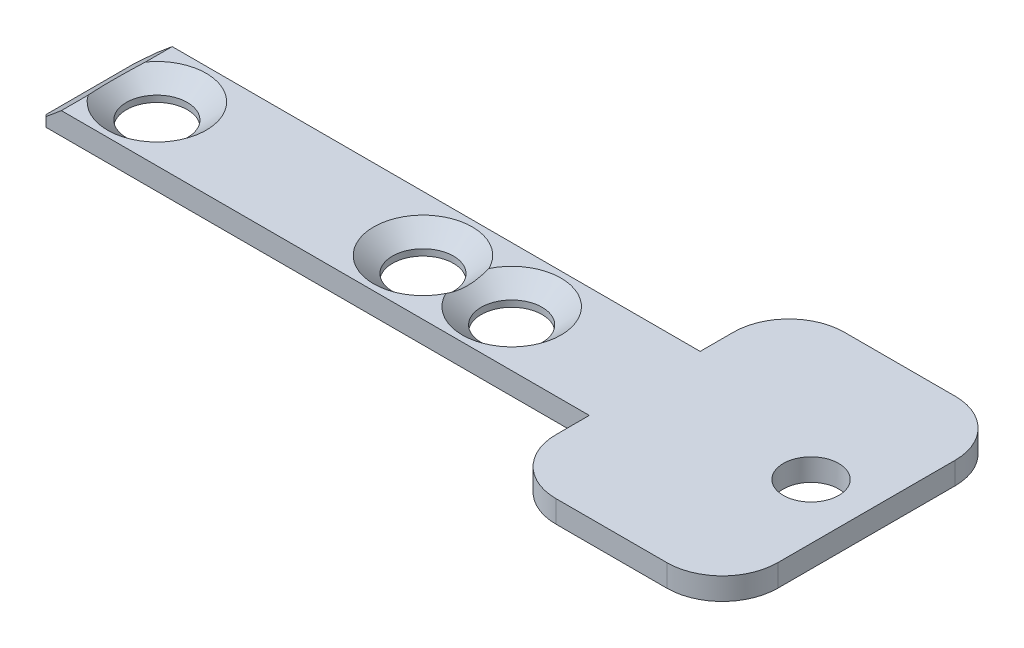
ISO-10303-21;
HEADER;
FILE_DESCRIPTION(('STEP AP214'),'2;1');
FILE_NAME('part.step','',(''),(''),'','','');
FILE_SCHEMA(('AUTOMOTIVE_DESIGN { 1 0 10303 214 1 1 1 1 }'));
ENDSEC;
DATA;
#1=APPLICATION_CONTEXT('core data for automotive mechanical design processes');
#2=APPLICATION_PROTOCOL_DEFINITION('international standard','automotive_design',2000,#1);
#3=PRODUCT_CONTEXT('',#1,'mechanical');
#4=PRODUCT('Part','Part','',(#3));
#5=PRODUCT_RELATED_PRODUCT_CATEGORY('part','',(#4));
#6=PRODUCT_DEFINITION_FORMATION('','',#4);
#7=PRODUCT_DEFINITION_CONTEXT('part definition',#1,'design');
#8=PRODUCT_DEFINITION('design','',#6,#7);
#9=PRODUCT_DEFINITION_SHAPE('','',#8);
#10=(LENGTH_UNIT() NAMED_UNIT(*) SI_UNIT(.MILLI.,.METRE.));
#11=(NAMED_UNIT(*) PLANE_ANGLE_UNIT() SI_UNIT($,.RADIAN.));
#12=(NAMED_UNIT(*) SI_UNIT($,.STERADIAN.) SOLID_ANGLE_UNIT());
#13=UNCERTAINTY_MEASURE_WITH_UNIT(LENGTH_MEASURE(1.E-05),#10,'distance_accuracy_value','');
#14=(GEOMETRIC_REPRESENTATION_CONTEXT(3) GLOBAL_UNCERTAINTY_ASSIGNED_CONTEXT((#13)) GLOBAL_UNIT_ASSIGNED_CONTEXT((#10,
#11,#12)) REPRESENTATION_CONTEXT('',''));
#15=CARTESIAN_POINT('',(0.,0.,0.));
#16=DIRECTION('',(0.,0.,1.));
#17=DIRECTION('',(1.,0.,0.));
#18=AXIS2_PLACEMENT_3D('',#15,#16,#17);
#19=CARTESIAN_POINT('',(25.,2.,13.));
#20=DIRECTION('',(1.,0.,0.));
#21=DIRECTION('',(0.,0.,-1.));
#22=AXIS2_PLACEMENT_3D('',#19,#20,#21);
#23=PLANE('',#22);
#24=DIRECTION('',(0.,0.,1.));
#25=VECTOR('',#24,1.);
#26=CARTESIAN_POINT('',(25.,0.,13.));
#27=LINE('',#26,#25);
#28=CARTESIAN_POINT('',(25.,0.,5.));
#29=VERTEX_POINT('',#28);
#30=CARTESIAN_POINT('',(25.,0.,8.));
#31=VERTEX_POINT('',#30);
#32=EDGE_CURVE('E194',#29,#31,#27,.T.);
#33=ORIENTED_EDGE('',*,*,#32,.T.);
#34=DIRECTION('',(0.,-1.,0.));
#35=VECTOR('',#34,1.);
#36=CARTESIAN_POINT('',(25.,2.,8.));
#37=LINE('',#36,#35);
#38=CARTESIAN_POINT('',(25.,2.,8.));
#39=VERTEX_POINT('',#38);
#40=EDGE_CURVE('E256',#31,#39,#37,.F.);
#41=ORIENTED_EDGE('',*,*,#40,.T.);
#42=DIRECTION('',(0.,0.,1.));
#43=VECTOR('',#42,1.);
#44=CARTESIAN_POINT('',(25.,2.,13.));
#45=LINE('',#44,#43);
#46=CARTESIAN_POINT('',(25.,2.,5.));
#47=VERTEX_POINT('',#46);
#48=EDGE_CURVE('E215',#47,#39,#45,.T.);
#49=ORIENTED_EDGE('',*,*,#48,.F.);
#50=DIRECTION('',(0.,-1.,0.));
#51=VECTOR('',#50,1.);
#52=CARTESIAN_POINT('',(25.,2.,5.));
#53=LINE('',#52,#51);
#54=EDGE_CURVE('E183',#47,#29,#53,.T.);
#55=ORIENTED_EDGE('',*,*,#54,.T.);
#56=EDGE_LOOP('',(#33,#41,#49,#55));
#57=FACE_BOUND('',#56,.T.);
#58=ADVANCED_FACE('F35',(#57),#23,.F.);
#59=CARTESIAN_POINT('',(25.,2.,13.));
#60=DIRECTION('',(0.,0.,-1.));
#61=DIRECTION('',(-1.,0.,0.));
#62=AXIS2_PLACEMENT_3D('',#59,#60,#61);
#63=PLANE('',#62);
#64=DIRECTION('',(1.,0.,0.));
#65=VECTOR('',#64,1.);
#66=CARTESIAN_POINT('',(25.,0.,13.));
#67=LINE('',#66,#65);
#68=CARTESIAN_POINT('',(30.,0.,13.));
#69=VERTEX_POINT('',#68);
#70=CARTESIAN_POINT('',(40.,0.,13.));
#71=VERTEX_POINT('',#70);
#72=EDGE_CURVE('E197',#69,#71,#67,.T.);
#73=ORIENTED_EDGE('',*,*,#72,.T.);
#74=DIRECTION('',(0.,-1.,0.));
#75=VECTOR('',#74,1.);
#76=CARTESIAN_POINT('',(40.,2.,13.));
#77=LINE('',#76,#75);
#78=CARTESIAN_POINT('',(40.,2.,13.));
#79=VERTEX_POINT('',#78);
#80=EDGE_CURVE('E254',#71,#79,#77,.F.);
#81=ORIENTED_EDGE('',*,*,#80,.T.);
#82=DIRECTION('',(1.,0.,0.));
#83=VECTOR('',#82,1.);
#84=CARTESIAN_POINT('',(25.,2.,13.));
#85=LINE('',#84,#83);
#86=CARTESIAN_POINT('',(30.,2.,13.));
#87=VERTEX_POINT('',#86);
#88=EDGE_CURVE('E365',#87,#79,#85,.T.);
#89=ORIENTED_EDGE('',*,*,#88,.F.);
#90=DIRECTION('',(0.,-1.,0.));
#91=VECTOR('',#90,1.);
#92=CARTESIAN_POINT('',(30.,2.,13.));
#93=LINE('',#92,#91);
#94=EDGE_CURVE('E251',#87,#69,#93,.T.);
#95=ORIENTED_EDGE('',*,*,#94,.T.);
#96=EDGE_LOOP('',(#73,#81,#89,#95));
#97=FACE_BOUND('',#96,.T.);
#98=ADVANCED_FACE('F324',(#97),#63,.F.);
#99=CARTESIAN_POINT('',(45.,2.,13.));
#100=DIRECTION('',(-1.,0.,0.));
#101=DIRECTION('',(0.,0.,1.));
#102=AXIS2_PLACEMENT_3D('',#99,#100,#101);
#103=PLANE('',#102);
#104=DIRECTION('',(0.,0.,-1.));
#105=VECTOR('',#104,1.);
#106=CARTESIAN_POINT('',(45.,0.,13.));
#107=LINE('',#106,#105);
#108=CARTESIAN_POINT('',(45.,0.,8.));
#109=VERTEX_POINT('',#108);
#110=CARTESIAN_POINT('',(45.,0.,-8.));
#111=VERTEX_POINT('',#110);
#112=EDGE_CURVE('E201',#109,#111,#107,.T.);
#113=ORIENTED_EDGE('',*,*,#112,.T.);
#114=DIRECTION('',(0.,-1.,0.));
#115=VECTOR('',#114,1.);
#116=CARTESIAN_POINT('',(45.,2.,-8.));
#117=LINE('',#116,#115);
#118=CARTESIAN_POINT('',(45.,2.,-8.));
#119=VERTEX_POINT('',#118);
#120=EDGE_CURVE('E242',#111,#119,#117,.F.);
#121=ORIENTED_EDGE('',*,*,#120,.T.);
#122=DIRECTION('',(0.,0.,-1.));
#123=VECTOR('',#122,1.);
#124=CARTESIAN_POINT('',(45.,2.,13.));
#125=LINE('',#124,#123);
#126=CARTESIAN_POINT('',(45.,2.,8.));
#127=VERTEX_POINT('',#126);
#128=EDGE_CURVE('E370',#127,#119,#125,.T.);
#129=ORIENTED_EDGE('',*,*,#128,.F.);
#130=DIRECTION('',(0.,-1.,0.));
#131=VECTOR('',#130,1.);
#132=CARTESIAN_POINT('',(45.,2.,8.));
#133=LINE('',#132,#131);
#134=EDGE_CURVE('E239',#127,#109,#133,.T.);
#135=ORIENTED_EDGE('',*,*,#134,.T.);
#136=EDGE_LOOP('',(#113,#121,#129,#135));
#137=FACE_BOUND('',#136,.T.);
#138=ADVANCED_FACE('F330',(#137),#103,.F.);
#139=CARTESIAN_POINT('',(25.,2.,-13.));
#140=DIRECTION('',(0.,0.,1.));
#141=DIRECTION('',(1.,0.,0.));
#142=AXIS2_PLACEMENT_3D('',#139,#140,#141);
#143=PLANE('',#142);
#144=DIRECTION('',(-1.,0.,0.));
#145=VECTOR('',#144,1.);
#146=CARTESIAN_POINT('',(25.,2.,-13.));
#147=LINE('',#146,#145);
#148=CARTESIAN_POINT('',(40.,2.,-13.));
#149=VERTEX_POINT('',#148);
#150=CARTESIAN_POINT('',(30.,2.,-13.));
#151=VERTEX_POINT('',#150);
#152=EDGE_CURVE('E172',#149,#151,#147,.T.);
#153=ORIENTED_EDGE('',*,*,#152,.F.);
#154=DIRECTION('',(0.,-1.,0.));
#155=VECTOR('',#154,1.);
#156=CARTESIAN_POINT('',(40.,2.,-13.));
#157=LINE('',#156,#155);
#158=CARTESIAN_POINT('',(40.,0.,-13.));
#159=VERTEX_POINT('',#158);
#160=EDGE_CURVE('E228',#149,#159,#157,.T.);
#161=ORIENTED_EDGE('',*,*,#160,.T.);
#162=DIRECTION('',(-1.,0.,0.));
#163=VECTOR('',#162,1.);
#164=CARTESIAN_POINT('',(25.,0.,-13.));
#165=LINE('',#164,#163);
#166=CARTESIAN_POINT('',(30.,0.,-13.));
#167=VERTEX_POINT('',#166);
#168=EDGE_CURVE('E204',#159,#167,#165,.T.);
#169=ORIENTED_EDGE('',*,*,#168,.T.);
#170=DIRECTION('',(0.,-1.,0.));
#171=VECTOR('',#170,1.);
#172=CARTESIAN_POINT('',(30.,2.,-13.));
#173=LINE('',#172,#171);
#174=EDGE_CURVE('E226',#167,#151,#173,.F.);
#175=ORIENTED_EDGE('',*,*,#174,.T.);
#176=EDGE_LOOP('',(#153,#161,#169,#175));
#177=FACE_BOUND('',#176,.T.);
#178=ADVANCED_FACE('F428',(#177),#143,.F.);
#179=CARTESIAN_POINT('',(25.,2.,-5.));
#180=DIRECTION('',(1.,0.,0.));
#181=DIRECTION('',(0.,0.,-1.));
#182=AXIS2_PLACEMENT_3D('',#179,#180,#181);
#183=PLANE('',#182);
#184=DIRECTION('',(0.,0.,1.));
#185=VECTOR('',#184,1.);
#186=CARTESIAN_POINT('',(25.,2.,-5.));
#187=LINE('',#186,#185);
#188=CARTESIAN_POINT('',(25.,2.,-8.));
#189=VERTEX_POINT('',#188);
#190=CARTESIAN_POINT('',(25.,2.,-5.));
#191=VERTEX_POINT('',#190);
#192=EDGE_CURVE('E159',#189,#191,#187,.T.);
#193=ORIENTED_EDGE('',*,*,#192,.F.);
#194=DIRECTION('',(0.,-1.,0.));
#195=VECTOR('',#194,1.);
#196=CARTESIAN_POINT('',(25.,2.,-8.));
#197=LINE('',#196,#195);
#198=CARTESIAN_POINT('',(25.,0.,-8.));
#199=VERTEX_POINT('',#198);
#200=EDGE_CURVE('E258',#189,#199,#197,.T.);
#201=ORIENTED_EDGE('',*,*,#200,.T.);
#202=DIRECTION('',(0.,0.,1.));
#203=VECTOR('',#202,1.);
#204=CARTESIAN_POINT('',(25.,0.,-5.));
#205=LINE('',#204,#203);
#206=CARTESIAN_POINT('',(25.,0.,-5.));
#207=VERTEX_POINT('',#206);
#208=EDGE_CURVE('E178',#199,#207,#205,.T.);
#209=ORIENTED_EDGE('',*,*,#208,.T.);
#210=DIRECTION('',(0.,-1.,0.));
#211=VECTOR('',#210,1.);
#212=CARTESIAN_POINT('',(25.,2.,-5.));
#213=LINE('',#212,#211);
#214=EDGE_CURVE('E175',#191,#207,#213,.T.);
#215=ORIENTED_EDGE('',*,*,#214,.F.);
#216=EDGE_LOOP('',(#193,#201,#209,#215));
#217=FACE_BOUND('',#216,.T.);
#218=ADVANCED_FACE('F176',(#217),#183,.F.);
#219=CARTESIAN_POINT('',(-25.,2.,-5.));
#220=DIRECTION('',(0.,0.,1.));
#221=DIRECTION('',(1.,0.,0.));
#222=AXIS2_PLACEMENT_3D('',#219,#220,#221);
#223=PLANE('',#222);
#224=DIRECTION('',(0.,1.,0.));
#225=VECTOR('',#224,1.);
#226=CARTESIAN_POINT('',(-24.,2.,-5.));
#227=LINE('',#226,#225);
#228=CARTESIAN_POINT('',(-24.,0.,-5.));
#229=VERTEX_POINT('',#228);
#230=CARTESIAN_POINT('',(-24.,0.839099631177281,-5.));
#231=VERTEX_POINT('',#230);
#232=EDGE_CURVE('E222',#229,#231,#227,.T.);
#233=ORIENTED_EDGE('',*,*,#232,.T.);
#234=DIRECTION('',(-0.766044443118977,-0.642787609686541,0.));
#235=VECTOR('',#234,1.);
#236=CARTESIAN_POINT('',(-22.6164928148116,2.,-5.));
#237=LINE('',#236,#235);
#238=CARTESIAN_POINT('',(-22.6164928148116,2.,-5.));
#239=VERTEX_POINT('',#238);
#240=EDGE_CURVE('E188',#231,#239,#237,.F.);
#241=ORIENTED_EDGE('',*,*,#240,.T.);
#242=DIRECTION('',(-1.,0.,0.));
#243=VECTOR('',#242,1.);
#244=CARTESIAN_POINT('',(-25.,2.,-5.));
#245=LINE('',#244,#243);
#246=EDGE_CURVE('E164',#191,#239,#245,.T.);
#247=ORIENTED_EDGE('',*,*,#246,.F.);
#248=ORIENTED_EDGE('',*,*,#214,.T.);
#249=DIRECTION('',(-1.,0.,0.));
#250=VECTOR('',#249,1.);
#251=CARTESIAN_POINT('',(-25.,0.,-5.));
#252=LINE('',#251,#250);
#253=EDGE_CURVE('E208',#207,#229,#252,.T.);
#254=ORIENTED_EDGE('',*,*,#253,.T.);
#255=EDGE_LOOP('',(#233,#241,#247,#248,#254));
#256=FACE_BOUND('',#255,.T.);
#257=ADVANCED_FACE('F186',(#256),#223,.F.);
#258=CARTESIAN_POINT('',(-25.,2.,5.));
#259=DIRECTION('',(0.,0.,-1.));
#260=DIRECTION('',(-1.,0.,0.));
#261=AXIS2_PLACEMENT_3D('',#258,#259,#260);
#262=PLANE('',#261);
#263=DIRECTION('',(1.,0.,0.));
#264=VECTOR('',#263,1.);
#265=CARTESIAN_POINT('',(-25.,2.,5.));
#266=LINE('',#265,#264);
#267=CARTESIAN_POINT('',(-22.6164928148116,2.,5.));
#268=VERTEX_POINT('',#267);
#269=EDGE_CURVE('E189',#268,#47,#266,.T.);
#270=ORIENTED_EDGE('',*,*,#269,.F.);
#271=DIRECTION('',(0.766044443118977,0.642787609686541,0.));
#272=VECTOR('',#271,1.);
#273=CARTESIAN_POINT('',(-22.6164928148116,2.,5.));
#274=LINE('',#273,#272);
#275=CARTESIAN_POINT('',(-24.,0.83909963117727,5.));
#276=VERTEX_POINT('',#275);
#277=EDGE_CURVE('E275',#268,#276,#274,.F.);
#278=ORIENTED_EDGE('',*,*,#277,.T.);
#279=DIRECTION('',(0.,-1.,0.));
#280=VECTOR('',#279,1.);
#281=CARTESIAN_POINT('',(-24.,2.,5.));
#282=LINE('',#281,#280);
#283=CARTESIAN_POINT('',(-24.,0.,5.));
#284=VERTEX_POINT('',#283);
#285=EDGE_CURVE('E224',#276,#284,#282,.T.);
#286=ORIENTED_EDGE('',*,*,#285,.T.);
#287=DIRECTION('',(1.,0.,0.));
#288=VECTOR('',#287,1.);
#289=CARTESIAN_POINT('',(-25.,0.,5.));
#290=LINE('',#289,#288);
#291=EDGE_CURVE('E213',#284,#29,#290,.T.);
#292=ORIENTED_EDGE('',*,*,#291,.T.);
#293=ORIENTED_EDGE('',*,*,#54,.F.);
#294=EDGE_LOOP('',(#270,#278,#286,#292,#293));
#295=FACE_BOUND('',#294,.T.);
#296=ADVANCED_FACE('F415',(#295),#262,.F.);
#297=CARTESIAN_POINT('',(0.,2.,0.));
#298=DIRECTION('',(0.,-1.,0.));
#299=DIRECTION('',(0.,0.,-1.));
#300=AXIS2_PLACEMENT_3D('',#297,#298,#299);
#301=PLANE('',#300);
#302=CARTESIAN_POINT('',(5.,2.,0.));
#303=DIRECTION('',(0.,-1.,0.));
#304=DIRECTION('',(0.,0.,-1.));
#305=AXIS2_PLACEMENT_3D('',#302,#303,#304);
#306=CIRCLE('',#305,4.45000000000001);
#307=CARTESIAN_POINT('',(5.,2.,4.45000000000001));
#308=VERTEX_POINT('',#307);
#309=CARTESIAN_POINT('',(9.,2.,-1.95000000000002));
#310=VERTEX_POINT('',#309);
#311=EDGE_CURVE('E288',#308,#310,#306,.T.);
#312=ORIENTED_EDGE('',*,*,#311,.T.);
#313=CARTESIAN_POINT('',(13.,2.,0.));
#314=DIRECTION('',(0.,-1.,0.));
#315=DIRECTION('',(0.,0.,-1.));
#316=AXIS2_PLACEMENT_3D('',#313,#314,#315);
#317=CIRCLE('',#316,4.45000000000001);
#318=CARTESIAN_POINT('',(13.,2.,4.45000000000001));
#319=VERTEX_POINT('',#318);
#320=EDGE_CURVE('E293',#310,#319,#317,.T.);
#321=ORIENTED_EDGE('',*,*,#320,.T.);
#322=CARTESIAN_POINT('',(13.,2.,0.));
#323=DIRECTION('',(0.,-1.,0.));
#324=DIRECTION('',(0.,0.,-1.));
#325=AXIS2_PLACEMENT_3D('',#322,#323,#324);
#326=CIRCLE('',#325,4.45000000000001);
#327=CARTESIAN_POINT('',(9.,2.,1.95000000000002));
#328=VERTEX_POINT('',#327);
#329=EDGE_CURVE('E57',#319,#328,#326,.T.);
#330=ORIENTED_EDGE('',*,*,#329,.T.);
#331=CARTESIAN_POINT('',(5.,2.,0.));
#332=DIRECTION('',(0.,-1.,0.));
#333=DIRECTION('',(0.,0.,-1.));
#334=AXIS2_PLACEMENT_3D('',#331,#332,#333);
#335=CIRCLE('',#334,4.45000000000001);
#336=EDGE_CURVE('E290',#328,#308,#335,.T.);
#337=ORIENTED_EDGE('',*,*,#336,.T.);
#338=EDGE_LOOP('',(#312,#321,#330,#337));
#339=FACE_BOUND('',#338,.T.);
#340=CARTESIAN_POINT('',(40.,2.,0.));
#341=DIRECTION('',(0.,1.,0.));
#342=DIRECTION('',(0.,0.,1.));
#343=AXIS2_PLACEMENT_3D('',#340,#341,#342);
#344=CIRCLE('',#343,2.5);
#345=CARTESIAN_POINT('',(40.,2.,2.5));
#346=VERTEX_POINT('',#345);
#347=EDGE_CURVE('E263',#346,#346,#344,.T.);
#348=ORIENTED_EDGE('',*,*,#347,.F.);
#349=EDGE_LOOP('',(#348));
#350=FACE_BOUND('',#349,.T.);
#351=DIRECTION('',(0.,0.,1.));
#352=VECTOR('',#351,1.);
#353=CARTESIAN_POINT('',(-22.6164928148116,2.,0.));
#354=LINE('',#353,#352);
#355=CARTESIAN_POINT('',(-22.6164928148116,2.,-2.59296735814709));
#356=VERTEX_POINT('',#355);
#357=EDGE_CURVE('E273',#239,#356,#354,.T.);
#358=ORIENTED_EDGE('',*,*,#357,.T.);
#359=CARTESIAN_POINT('',(-19.,2.,0.));
#360=DIRECTION('',(0.,-1.,0.));
#361=DIRECTION('',(0.,0.,-1.));
#362=AXIS2_PLACEMENT_3D('',#359,#360,#361);
#363=CIRCLE('',#362,4.45000000000001);
#364=CARTESIAN_POINT('',(-22.6164928148116,2.,2.59296735814709));
#365=VERTEX_POINT('',#364);
#366=EDGE_CURVE('E285',#356,#365,#363,.T.);
#367=ORIENTED_EDGE('',*,*,#366,.T.);
#368=EDGE_CURVE('E260',#365,#268,#354,.T.);
#369=ORIENTED_EDGE('',*,*,#368,.T.);
#370=ORIENTED_EDGE('',*,*,#269,.T.);
#371=ORIENTED_EDGE('',*,*,#48,.T.);
#372=CARTESIAN_POINT('',(30.,2.,8.));
#373=DIRECTION('',(0.,-1.,0.));
#374=DIRECTION('',(0.,0.,-1.));
#375=AXIS2_PLACEMENT_3D('',#372,#373,#374);
#376=CIRCLE('',#375,5.);
#377=EDGE_CURVE('E245',#39,#87,#376,.F.);
#378=ORIENTED_EDGE('',*,*,#377,.T.);
#379=ORIENTED_EDGE('',*,*,#88,.T.);
#380=CARTESIAN_POINT('',(40.,2.,8.));
#381=DIRECTION('',(0.,-1.,0.));
#382=DIRECTION('',(0.,0.,-1.));
#383=AXIS2_PLACEMENT_3D('',#380,#381,#382);
#384=CIRCLE('',#383,5.);
#385=EDGE_CURVE('E247',#79,#127,#384,.F.);
#386=ORIENTED_EDGE('',*,*,#385,.T.);
#387=ORIENTED_EDGE('',*,*,#128,.T.);
#388=CARTESIAN_POINT('',(40.,2.,-8.));
#389=DIRECTION('',(0.,-1.,0.));
#390=DIRECTION('',(0.,0.,-1.));
#391=AXIS2_PLACEMENT_3D('',#388,#389,#390);
#392=CIRCLE('',#391,5.);
#393=EDGE_CURVE('E249',#119,#149,#392,.F.);
#394=ORIENTED_EDGE('',*,*,#393,.T.);
#395=ORIENTED_EDGE('',*,*,#152,.T.);
#396=CARTESIAN_POINT('',(30.,2.,-8.));
#397=DIRECTION('',(0.,-1.,0.));
#398=DIRECTION('',(0.,0.,-1.));
#399=AXIS2_PLACEMENT_3D('',#396,#397,#398);
#400=CIRCLE('',#399,5.);
#401=EDGE_CURVE('E168',#151,#189,#400,.F.);
#402=ORIENTED_EDGE('',*,*,#401,.T.);
#403=ORIENTED_EDGE('',*,*,#192,.T.);
#404=ORIENTED_EDGE('',*,*,#246,.T.);
#405=EDGE_LOOP('',(#358,#367,#369,#370,#371,#378,#379,#386,#387,#394,#395,#402,#403,#404));
#406=FACE_BOUND('',#405,.T.);
#407=ADVANCED_FACE('F162',(#339,#350,#406),#301,.F.);
#408=CARTESIAN_POINT('',(0.,0.,0.));
#409=DIRECTION('',(0.,-1.,0.));
#410=DIRECTION('',(0.,0.,-1.));
#411=AXIS2_PLACEMENT_3D('',#408,#409,#410);
#412=PLANE('',#411);
#413=CARTESIAN_POINT('',(-19.,0.,0.));
#414=DIRECTION('',(0.,-1.,0.));
#415=DIRECTION('',(0.,0.,-1.));
#416=AXIS2_PLACEMENT_3D('',#413,#414,#415);
#417=CIRCLE('',#416,2.75);
#418=CARTESIAN_POINT('',(-19.,0.,-2.75));
#419=VERTEX_POINT('',#418);
#420=EDGE_CURVE('E270',#419,#419,#417,.T.);
#421=ORIENTED_EDGE('',*,*,#420,.F.);
#422=EDGE_LOOP('',(#421));
#423=FACE_BOUND('',#422,.T.);
#424=CARTESIAN_POINT('',(5.,0.,0.));
#425=DIRECTION('',(0.,-1.,0.));
#426=DIRECTION('',(0.,0.,-1.));
#427=AXIS2_PLACEMENT_3D('',#424,#425,#426);
#428=CIRCLE('',#427,2.75);
#429=CARTESIAN_POINT('',(5.,0.,-2.75));
#430=VERTEX_POINT('',#429);
#431=EDGE_CURVE('E267',#430,#430,#428,.T.);
#432=ORIENTED_EDGE('',*,*,#431,.F.);
#433=EDGE_LOOP('',(#432));
#434=FACE_BOUND('',#433,.T.);
#435=CARTESIAN_POINT('',(13.,0.,0.));
#436=DIRECTION('',(0.,-1.,0.));
#437=DIRECTION('',(0.,0.,-1.));
#438=AXIS2_PLACEMENT_3D('',#435,#436,#437);
#439=CIRCLE('',#438,2.75);
#440=CARTESIAN_POINT('',(13.,0.,-2.75));
#441=VERTEX_POINT('',#440);
#442=EDGE_CURVE('E264',#441,#441,#439,.T.);
#443=ORIENTED_EDGE('',*,*,#442,.F.);
#444=EDGE_LOOP('',(#443));
#445=FACE_BOUND('',#444,.T.);
#446=CARTESIAN_POINT('',(40.,0.,0.));
#447=DIRECTION('',(0.,-1.,0.));
#448=DIRECTION('',(0.,0.,-1.));
#449=AXIS2_PLACEMENT_3D('',#446,#447,#448);
#450=CIRCLE('',#449,2.5);
#451=CARTESIAN_POINT('',(40.,0.,-2.5));
#452=VERTEX_POINT('',#451);
#453=EDGE_CURVE('E198',#452,#452,#450,.T.);
#454=ORIENTED_EDGE('',*,*,#453,.F.);
#455=EDGE_LOOP('',(#454));
#456=FACE_BOUND('',#455,.T.);
#457=ORIENTED_EDGE('',*,*,#168,.F.);
#458=CARTESIAN_POINT('',(40.,0.,-8.));
#459=DIRECTION('',(0.,-1.,0.));
#460=DIRECTION('',(0.,0.,-1.));
#461=AXIS2_PLACEMENT_3D('',#458,#459,#460);
#462=CIRCLE('',#461,5.);
#463=EDGE_CURVE('E237',#159,#111,#462,.T.);
#464=ORIENTED_EDGE('',*,*,#463,.T.);
#465=ORIENTED_EDGE('',*,*,#112,.F.);
#466=CARTESIAN_POINT('',(40.,0.,8.));
#467=DIRECTION('',(0.,-1.,0.));
#468=DIRECTION('',(0.,0.,-1.));
#469=AXIS2_PLACEMENT_3D('',#466,#467,#468);
#470=CIRCLE('',#469,5.);
#471=EDGE_CURVE('E235',#109,#71,#470,.T.);
#472=ORIENTED_EDGE('',*,*,#471,.T.);
#473=ORIENTED_EDGE('',*,*,#72,.F.);
#474=CARTESIAN_POINT('',(30.,0.,8.));
#475=DIRECTION('',(0.,-1.,0.));
#476=DIRECTION('',(0.,0.,-1.));
#477=AXIS2_PLACEMENT_3D('',#474,#475,#476);
#478=CIRCLE('',#477,5.);
#479=EDGE_CURVE('E233',#69,#31,#478,.T.);
#480=ORIENTED_EDGE('',*,*,#479,.T.);
#481=ORIENTED_EDGE('',*,*,#32,.F.);
#482=ORIENTED_EDGE('',*,*,#291,.F.);
#483=DIRECTION('',(0.707106781186548,0.,0.707106781186548));
#484=VECTOR('',#483,1.);
#485=CARTESIAN_POINT('',(-14.5,0.,14.5));
#486=LINE('',#485,#484);
#487=CARTESIAN_POINT('',(-25.,0.,4.00000000000001));
#488=VERTEX_POINT('',#487);
#489=EDGE_CURVE('E182',#284,#488,#486,.F.);
#490=ORIENTED_EDGE('',*,*,#489,.T.);
#491=DIRECTION('',(0.,0.,1.));
#492=VECTOR('',#491,1.);
#493=CARTESIAN_POINT('',(-25.,0.,-5.));
#494=LINE('',#493,#492);
#495=CARTESIAN_POINT('',(-25.,0.,-3.99999999999999));
#496=VERTEX_POINT('',#495);
#497=EDGE_CURVE('E210',#496,#488,#494,.T.);
#498=ORIENTED_EDGE('',*,*,#497,.F.);
#499=DIRECTION('',(-0.707106781186548,0.,0.707106781186548));
#500=VECTOR('',#499,1.);
#501=CARTESIAN_POINT('',(-14.5,0.,-14.5));
#502=LINE('',#501,#500);
#503=EDGE_CURVE('E220',#496,#229,#502,.F.);
#504=ORIENTED_EDGE('',*,*,#503,.T.);
#505=ORIENTED_EDGE('',*,*,#253,.F.);
#506=ORIENTED_EDGE('',*,*,#208,.F.);
#507=CARTESIAN_POINT('',(30.,0.,-8.));
#508=DIRECTION('',(0.,-1.,0.));
#509=DIRECTION('',(0.,0.,-1.));
#510=AXIS2_PLACEMENT_3D('',#507,#508,#509);
#511=CIRCLE('',#510,5.);
#512=EDGE_CURVE('E231',#199,#167,#511,.T.);
#513=ORIENTED_EDGE('',*,*,#512,.T.);
#514=EDGE_LOOP('',(#457,#464,#465,#472,#473,#480,#481,#482,#490,#498,#504,#505,#506,#513));
#515=FACE_BOUND('',#514,.T.);
#516=ADVANCED_FACE('F339',(#423,#434,#445,#456,#515),#412,.T.);
#517=CARTESIAN_POINT('',(-25.,2.,-3.99999999999999));
#518=DIRECTION('',(0.707106781186547,0.,0.707106781186547));
#519=DIRECTION('',(0.,-1.,0.));
#520=AXIS2_PLACEMENT_3D('',#517,#518,#519);
#521=PLANE('',#520);
#522=ORIENTED_EDGE('',*,*,#503,.F.);
#523=DIRECTION('',(0.608120402411342,0.510273605374739,-0.608120402411342));
#524=VECTOR('',#523,1.);
#525=CARTESIAN_POINT('',(-24.3793844195193,0.520758304684262,-4.62061558048074));
#526=LINE('',#525,#524);
#527=EDGE_CURVE('E279',#496,#231,#526,.T.);
#528=ORIENTED_EDGE('',*,*,#527,.T.);
#529=ORIENTED_EDGE('',*,*,#232,.F.);
#530=EDGE_LOOP('',(#522,#528,#529));
#531=FACE_BOUND('',#530,.T.);
#532=ADVANCED_FACE('F335',(#531),#521,.F.);
#533=CARTESIAN_POINT('',(-24.,2.,5.));
#534=DIRECTION('',(0.707106781186547,0.,-0.707106781186547));
#535=DIRECTION('',(0.,-1.,0.));
#536=AXIS2_PLACEMENT_3D('',#533,#534,#535);
#537=PLANE('',#536);
#538=ORIENTED_EDGE('',*,*,#285,.F.);
#539=DIRECTION('',(-0.608120402411342,-0.510273605374739,-0.608120402411342));
#540=VECTOR('',#539,1.);
#541=CARTESIAN_POINT('',(-23.6397635718614,1.141373885165,5.36023642813861));
#542=LINE('',#541,#540);
#543=EDGE_CURVE('E277',#276,#488,#542,.T.);
#544=ORIENTED_EDGE('',*,*,#543,.T.);
#545=ORIENTED_EDGE('',*,*,#489,.F.);
#546=EDGE_LOOP('',(#538,#544,#545));
#547=FACE_BOUND('',#546,.T.);
#548=ADVANCED_FACE('F338',(#547),#537,.F.);
#549=CARTESIAN_POINT('',(40.,2.,-8.));
#550=DIRECTION('',(0.,-1.,0.));
#551=DIRECTION('',(0.,0.,-1.));
#552=AXIS2_PLACEMENT_3D('',#549,#550,#551);
#553=CYLINDRICAL_SURFACE('',#552,5.);
#554=ORIENTED_EDGE('',*,*,#393,.F.);
#555=ORIENTED_EDGE('',*,*,#120,.F.);
#556=ORIENTED_EDGE('',*,*,#463,.F.);
#557=ORIENTED_EDGE('',*,*,#160,.F.);
#558=EDGE_LOOP('',(#554,#555,#556,#557));
#559=FACE_BOUND('',#558,.T.);
#560=ADVANCED_FACE('F343',(#559),#553,.T.);
#561=CARTESIAN_POINT('',(40.,2.,8.));
#562=DIRECTION('',(0.,-1.,0.));
#563=DIRECTION('',(0.,0.,-1.));
#564=AXIS2_PLACEMENT_3D('',#561,#562,#563);
#565=CYLINDRICAL_SURFACE('',#564,5.);
#566=ORIENTED_EDGE('',*,*,#385,.F.);
#567=ORIENTED_EDGE('',*,*,#80,.F.);
#568=ORIENTED_EDGE('',*,*,#471,.F.);
#569=ORIENTED_EDGE('',*,*,#134,.F.);
#570=EDGE_LOOP('',(#566,#567,#568,#569));
#571=FACE_BOUND('',#570,.T.);
#572=ADVANCED_FACE('F347',(#571),#565,.T.);
#573=CARTESIAN_POINT('',(30.,2.,8.));
#574=DIRECTION('',(0.,-1.,0.));
#575=DIRECTION('',(0.,0.,-1.));
#576=AXIS2_PLACEMENT_3D('',#573,#574,#575);
#577=CYLINDRICAL_SURFACE('',#576,5.);
#578=ORIENTED_EDGE('',*,*,#377,.F.);
#579=ORIENTED_EDGE('',*,*,#40,.F.);
#580=ORIENTED_EDGE('',*,*,#479,.F.);
#581=ORIENTED_EDGE('',*,*,#94,.F.);
#582=EDGE_LOOP('',(#578,#579,#580,#581));
#583=FACE_BOUND('',#582,.T.);
#584=ADVANCED_FACE('F350',(#583),#577,.T.);
#585=CARTESIAN_POINT('',(30.,2.,-8.));
#586=DIRECTION('',(0.,-1.,0.));
#587=DIRECTION('',(0.,0.,-1.));
#588=AXIS2_PLACEMENT_3D('',#585,#586,#587);
#589=CYLINDRICAL_SURFACE('',#588,5.);
#590=ORIENTED_EDGE('',*,*,#401,.F.);
#591=ORIENTED_EDGE('',*,*,#174,.F.);
#592=ORIENTED_EDGE('',*,*,#512,.F.);
#593=ORIENTED_EDGE('',*,*,#200,.F.);
#594=EDGE_LOOP('',(#590,#591,#592,#593));
#595=FACE_BOUND('',#594,.T.);
#596=ADVANCED_FACE('F310',(#595),#589,.T.);
#597=CARTESIAN_POINT('',(40.,-1.,0.));
#598=DIRECTION('',(0.,1.,0.));
#599=DIRECTION('',(0.,0.,1.));
#600=AXIS2_PLACEMENT_3D('',#597,#598,#599);
#601=CYLINDRICAL_SURFACE('',#600,2.5);
#602=ORIENTED_EDGE('',*,*,#453,.T.);
#603=EDGE_LOOP('',(#602));
#604=FACE_BOUND('',#603,.T.);
#605=ORIENTED_EDGE('',*,*,#347,.T.);
#606=EDGE_LOOP('',(#605));
#607=FACE_BOUND('',#606,.T.);
#608=ADVANCED_FACE('F357',(#604,#607),#601,.F.);
#609=CARTESIAN_POINT('',(13.,-1.,0.));
#610=DIRECTION('',(0.,1.,0.));
#611=DIRECTION('',(0.,0.,1.));
#612=AXIS2_PLACEMENT_3D('',#609,#610,#611);
#613=CYLINDRICAL_SURFACE('',#612,2.75);
#614=CARTESIAN_POINT('',(13.,0.573530626998618,0.));
#615=DIRECTION('',(0.,-1.,0.));
#616=DIRECTION('',(0.,0.,-1.));
#617=AXIS2_PLACEMENT_3D('',#614,#615,#616);
#618=CIRCLE('',#617,2.75);
#619=CARTESIAN_POINT('',(13.,0.573530626998618,-2.75));
#620=VERTEX_POINT('',#619);
#621=EDGE_CURVE('E282',#620,#620,#618,.F.);
#622=ORIENTED_EDGE('',*,*,#621,.T.);
#623=EDGE_LOOP('',(#622));
#624=FACE_BOUND('',#623,.T.);
#625=ORIENTED_EDGE('',*,*,#442,.T.);
#626=EDGE_LOOP('',(#625));
#627=FACE_BOUND('',#626,.T.);
#628=ADVANCED_FACE('F409',(#624,#627),#613,.F.);
#629=CARTESIAN_POINT('',(5.,-1.,0.));
#630=DIRECTION('',(0.,1.,0.));
#631=DIRECTION('',(0.,0.,1.));
#632=AXIS2_PLACEMENT_3D('',#629,#630,#631);
#633=CYLINDRICAL_SURFACE('',#632,2.75);
#634=CARTESIAN_POINT('',(5.,0.573530626998619,0.));
#635=DIRECTION('',(0.,-1.,0.));
#636=DIRECTION('',(0.,0.,-1.));
#637=AXIS2_PLACEMENT_3D('',#634,#635,#636);
#638=CIRCLE('',#637,2.75);
#639=CARTESIAN_POINT('',(5.,0.573530626998619,-2.75));
#640=VERTEX_POINT('',#639);
#641=EDGE_CURVE('E295',#640,#640,#638,.F.);
#642=ORIENTED_EDGE('',*,*,#641,.T.);
#643=EDGE_LOOP('',(#642));
#644=FACE_BOUND('',#643,.T.);
#645=ORIENTED_EDGE('',*,*,#431,.T.);
#646=EDGE_LOOP('',(#645));
#647=FACE_BOUND('',#646,.T.);
#648=ADVANCED_FACE('F394',(#644,#647),#633,.F.);
#649=CARTESIAN_POINT('',(-19.,-1.,0.));
#650=DIRECTION('',(0.,1.,0.));
#651=DIRECTION('',(0.,0.,1.));
#652=AXIS2_PLACEMENT_3D('',#649,#650,#651);
#653=CYLINDRICAL_SURFACE('',#652,2.75);
#654=CARTESIAN_POINT('',(-19.,0.573530626998618,0.));
#655=DIRECTION('',(0.,-1.,0.));
#656=DIRECTION('',(0.,0.,-1.));
#657=AXIS2_PLACEMENT_3D('',#654,#655,#656);
#658=CIRCLE('',#657,2.75);
#659=CARTESIAN_POINT('',(-19.,0.573530626998618,-2.75));
#660=VERTEX_POINT('',#659);
#661=EDGE_CURVE('E50',#660,#660,#658,.F.);
#662=ORIENTED_EDGE('',*,*,#661,.T.);
#663=EDGE_LOOP('',(#662));
#664=FACE_BOUND('',#663,.T.);
#665=ORIENTED_EDGE('',*,*,#420,.T.);
#666=EDGE_LOOP('',(#665));
#667=FACE_BOUND('',#666,.T.);
#668=ADVANCED_FACE('F308',(#664,#667),#653,.F.);
#669=CARTESIAN_POINT('',(-22.6164928148116,2.,0.));
#670=DIRECTION('',(0.642787609686541,-0.766044443118977,0.));
#671=DIRECTION('',(0.,0.,1.));
#672=AXIS2_PLACEMENT_3D('',#669,#670,#671);
#673=PLANE('',#672);
#674=ORIENTED_EDGE('',*,*,#368,.F.);
#675=CARTESIAN_POINT('',(-22.6164928148116,2.,2.59296735814709));
#676=CARTESIAN_POINT('',(-22.6465158625045,1.97480767175404,2.49956850265806));
#677=CARTESIAN_POINT('',(-22.6751571453768,1.95077478185949,2.405419689739));
#678=CARTESIAN_POINT('',(-22.7295089158227,1.90516823132445,2.21567141656287));
#679=CARTESIAN_POINT('',(-22.7552188219997,1.88359505853374,2.12007167277997));
#680=CARTESIAN_POINT('',(-22.8277310437606,1.82275007999834,1.83103606304775));
#681=CARTESIAN_POINT('',(-22.869855957535,1.78740308038686,1.63554830125309));
#682=CARTESIAN_POINT('',(-22.940172762243,1.7284002754908,1.24109273457353));
#683=CARTESIAN_POINT('',(-22.9684151025809,1.70470213812972,1.04214029210957));
#684=CARTESIAN_POINT('',(-23.0102038984465,1.66963717493151,0.641704709903045));
#685=CARTESIAN_POINT('',(-23.0237588401276,1.65826322836631,0.440223099627736));
#686=CARTESIAN_POINT('',(-23.0353722953246,1.64851838239377,0.0472664967884791));
#687=CARTESIAN_POINT('',(-23.0342184253059,1.64948659430094,-0.144169326722982));
#688=CARTESIAN_POINT('',(-23.0183497972842,1.66280195422125,-0.526122022665256));
#689=CARTESIAN_POINT('',(-23.0036318970114,1.67515173891183,-0.716638671877532));
#690=CARTESIAN_POINT('',(-22.9611559014354,1.71079333113354,-1.09488310795486));
#691=CARTESIAN_POINT('',(-22.933415785885,1.73407005186071,-1.28261437305981));
#692=CARTESIAN_POINT('',(-22.8657690580597,1.79083239622926,-1.65421236846714));
#693=CARTESIAN_POINT('',(-22.8258674355992,1.82431383291926,-1.83808065072368));
#694=CARTESIAN_POINT('',(-22.756133173344,1.88282782665796,-2.11662585169061));
#695=CARTESIAN_POINT('',(-22.7302447948287,1.90455075552192,-2.21302404059215));
#696=CARTESIAN_POINT('',(-22.675531475825,1.95046068131847,-2.40418952129544));
#697=CARTESIAN_POINT('',(-22.6467120101167,1.97464308436501,-2.49895948078484));
#698=CARTESIAN_POINT('',(-22.6164928148116,2.,-2.59296735814709));
#699=B_SPLINE_CURVE_WITH_KNOTS('',3,(#675,#676,#677,#678,#679,#680,#681,#682,#683,#684,#685,
#686,#687,#688,#689,#690,#691,#692,#693,#694,#695,#696,#697,#698),.UNSPECIFIED.,.F.,.F.,(4,2,2,
2,2,2,2,2,2,2,2,4),(0.,0.303829937592374,0.607720031077206,1.21609948352411,1.82225142639757,
2.42805295693301,3.00155815464678,3.5751962451033,4.14804463337201,4.72065830007335,
5.02703605196586,5.33285170002814),.UNSPECIFIED.);
#700=EDGE_CURVE('E11',#365,#356,#699,.T.);
#701=ORIENTED_EDGE('',*,*,#700,.T.);
#702=ORIENTED_EDGE('',*,*,#357,.F.);
#703=ORIENTED_EDGE('',*,*,#240,.F.);
#704=ORIENTED_EDGE('',*,*,#527,.F.);
#705=ORIENTED_EDGE('',*,*,#497,.T.);
#706=ORIENTED_EDGE('',*,*,#543,.F.);
#707=ORIENTED_EDGE('',*,*,#277,.F.);
#708=EDGE_LOOP('',(#674,#701,#702,#703,#704,#705,#706,#707));
#709=FACE_BOUND('',#708,.T.);
#710=ADVANCED_FACE('F303',(#709),#673,.F.);
#711=CARTESIAN_POINT('',(5.,0.573530626998619,0.));
#712=DIRECTION('',(0.,1.,0.));
#713=DIRECTION('',(0.,0.,1.));
#714=AXIS2_PLACEMENT_3D('',#711,#712,#713);
#715=CONICAL_SURFACE('',#714,2.75,0.872664625997166);
#716=ORIENTED_EDGE('',*,*,#641,.F.);
#717=EDGE_LOOP('',(#716));
#718=FACE_BOUND('',#717,.T.);
#719=CARTESIAN_POINT('',(9.,2.0002,-1.95054386728573));
#720=CARTESIAN_POINT('',(9.,1.93859625140558,-1.78314076086768));
#721=CARTESIAN_POINT('',(9.,1.88259709621136,-1.6134002851666));
#722=CARTESIAN_POINT('',(9.,1.78472734232458,-1.26931855947313));
#723=CARTESIAN_POINT('',(9.,1.7429046947491,-1.09496380370928));
#724=CARTESIAN_POINT('',(9.,1.67799696730631,-0.749434072418259));
#725=CARTESIAN_POINT('',(9.,1.65427030166641,-0.578383612080314));
#726=CARTESIAN_POINT('',(9.,1.62514597694272,-0.234985519010729));
#727=CARTESIAN_POINT('',(9.,1.61971651529348,-0.0626406593573523));
#728=CARTESIAN_POINT('',(9.,1.62720472957861,0.264022489534569));
#729=CARTESIAN_POINT('',(9.,1.63830715467767,0.418386084117577));
#730=CARTESIAN_POINT('',(9.,1.67478997815271,0.725606749319927));
#731=CARTESIAN_POINT('',(9.,1.70019020498995,0.878461427145533));
#732=CARTESIAN_POINT('',(9.,1.76469155498106,1.18676230367918));
#733=CARTESIAN_POINT('',(9.,1.80424044655405,1.34211239859486));
#734=CARTESIAN_POINT('',(9.,1.89445464024647,1.6490903088672));
#735=CARTESIAN_POINT('',(9.,1.94508759664386,1.80072755645766));
#736=CARTESIAN_POINT('',(9.,2.0002,1.95054386728573));
#737=B_SPLINE_CURVE_WITH_KNOTS('',3,(#719,#720,#721,#722,#723,#724,#725,#726,#727,#728,#729,
#730,#731,#732,#733,#734,#735,#736),.UNSPECIFIED.,.F.,.F.,(4,2,2,2,2,2,2,2,4),(0.,
0.535428377296073,1.0726501444069,1.58980388618665,2.10605829263966,2.5696448398305,
3.03387588716557,3.51432980614091,3.99339991511124),.UNSPECIFIED.);
#738=EDGE_CURVE('E40',#310,#328,#737,.T.);
#739=ORIENTED_EDGE('',*,*,#738,.F.);
#740=ORIENTED_EDGE('',*,*,#311,.F.);
#741=ORIENTED_EDGE('',*,*,#336,.F.);
#742=EDGE_LOOP('',(#739,#740,#741));
#743=FACE_BOUND('',#742,.T.);
#744=ADVANCED_FACE('F307',(#718,#743),#715,.F.);
#745=CARTESIAN_POINT('',(13.,0.573530626998618,0.));
#746=DIRECTION('',(0.,1.,0.));
#747=DIRECTION('',(0.,0.,1.));
#748=AXIS2_PLACEMENT_3D('',#745,#746,#747);
#749=CONICAL_SURFACE('',#748,2.75,0.872664625997166);
#750=ORIENTED_EDGE('',*,*,#320,.F.);
#751=ORIENTED_EDGE('',*,*,#738,.T.);
#752=ORIENTED_EDGE('',*,*,#329,.F.);
#753=EDGE_LOOP('',(#750,#751,#752));
#754=FACE_BOUND('',#753,.T.);
#755=ORIENTED_EDGE('',*,*,#621,.F.);
#756=EDGE_LOOP('',(#755));
#757=FACE_BOUND('',#756,.T.);
#758=ADVANCED_FACE('F315',(#754,#757),#749,.F.);
#759=CARTESIAN_POINT('',(-19.,0.573530626998618,0.));
#760=DIRECTION('',(0.,1.,0.));
#761=DIRECTION('',(0.,0.,1.));
#762=AXIS2_PLACEMENT_3D('',#759,#760,#761);
#763=CONICAL_SURFACE('',#762,2.75,0.872664625997166);
#764=ORIENTED_EDGE('',*,*,#700,.F.);
#765=ORIENTED_EDGE('',*,*,#366,.F.);
#766=EDGE_LOOP('',(#764,#765));
#767=FACE_BOUND('',#766,.T.);
#768=ORIENTED_EDGE('',*,*,#661,.F.);
#769=EDGE_LOOP('',(#768));
#770=FACE_BOUND('',#769,.T.);
#771=ADVANCED_FACE('F37',(#767,#770),#763,.F.);
#772=CLOSED_SHELL('',(#58,#98,#138,#178,#218,#257,#296,#407,#516,#532,#548,#560,#572,#584,#596,
#608,#628,#648,#668,#710,#744,#758,#771));
#773=MANIFOLD_SOLID_BREP('B2',#772);
#774=ADVANCED_BREP_SHAPE_REPRESENTATION('',(#18,#773),#14);
#775=SHAPE_DEFINITION_REPRESENTATION(#9,#774);
ENDSEC;
END-ISO-10303-21;
